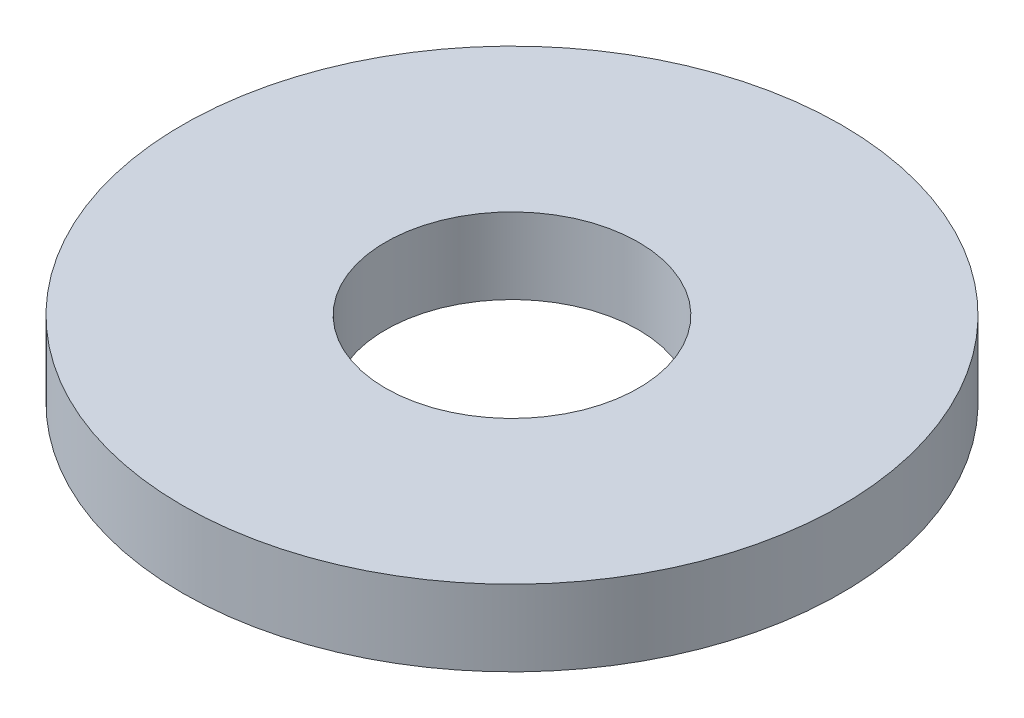
ISO-10303-21;
HEADER;
FILE_DESCRIPTION(('STEP AP214'),'2;1');
FILE_NAME('part.step','',(''),(''),'','','');
FILE_SCHEMA(('AUTOMOTIVE_DESIGN { 1 0 10303 214 1 1 1 1 }'));
ENDSEC;
DATA;
#1=APPLICATION_CONTEXT('core data for automotive mechanical design processes');
#2=APPLICATION_PROTOCOL_DEFINITION('international standard','automotive_design',2000,#1);
#3=PRODUCT_CONTEXT('',#1,'mechanical');
#4=PRODUCT('Part','Part','',(#3));
#5=PRODUCT_RELATED_PRODUCT_CATEGORY('part','',(#4));
#6=PRODUCT_DEFINITION_FORMATION('','',#4);
#7=PRODUCT_DEFINITION_CONTEXT('part definition',#1,'design');
#8=PRODUCT_DEFINITION('design','',#6,#7);
#9=PRODUCT_DEFINITION_SHAPE('','',#8);
#10=(LENGTH_UNIT() NAMED_UNIT(*) SI_UNIT(.MILLI.,.METRE.));
#11=(NAMED_UNIT(*) PLANE_ANGLE_UNIT() SI_UNIT($,.RADIAN.));
#12=(NAMED_UNIT(*) SI_UNIT($,.STERADIAN.) SOLID_ANGLE_UNIT());
#13=UNCERTAINTY_MEASURE_WITH_UNIT(LENGTH_MEASURE(1.E-05),#10,'distance_accuracy_value','');
#14=(GEOMETRIC_REPRESENTATION_CONTEXT(3) GLOBAL_UNCERTAINTY_ASSIGNED_CONTEXT((#13)) GLOBAL_UNIT_ASSIGNED_CONTEXT((#10,
#11,#12)) REPRESENTATION_CONTEXT('',''));
#15=CARTESIAN_POINT('',(0.,0.,0.));
#16=DIRECTION('',(0.,0.,1.));
#17=DIRECTION('',(1.,0.,0.));
#18=AXIS2_PLACEMENT_3D('',#15,#16,#17);
#19=CARTESIAN_POINT('',(0.,1.4478,0.));
#20=DIRECTION('',(0.,1.,0.));
#21=DIRECTION('',(0.,0.,1.));
#22=AXIS2_PLACEMENT_3D('',#19,#20,#21);
#23=PLANE('',#22);
#24=CARTESIAN_POINT('',(0.,1.4478,0.));
#25=DIRECTION('',(0.,1.,0.));
#26=DIRECTION('',(0.,0.,1.));
#27=AXIS2_PLACEMENT_3D('',#24,#25,#26);
#28=CIRCLE('',#27,6.2865);
#29=CARTESIAN_POINT('',(0.,1.4478,6.2865));
#30=VERTEX_POINT('',#29);
#31=EDGE_CURVE('E10',#30,#30,#28,.T.);
#32=ORIENTED_EDGE('',*,*,#31,.T.);
#33=EDGE_LOOP('',(#32));
#34=FACE_BOUND('',#33,.T.);
#35=CARTESIAN_POINT('',(0.,1.4478,0.));
#36=DIRECTION('',(0.,1.,0.));
#37=DIRECTION('',(0.,0.,1.));
#38=AXIS2_PLACEMENT_3D('',#35,#36,#37);
#39=CIRCLE('',#38,2.413);
#40=CARTESIAN_POINT('',(0.,1.4478,2.413));
#41=VERTEX_POINT('',#40);
#42=EDGE_CURVE('E42',#41,#41,#39,.T.);
#43=ORIENTED_EDGE('',*,*,#42,.F.);
#44=EDGE_LOOP('',(#43));
#45=FACE_BOUND('',#44,.T.);
#46=ADVANCED_FACE('F31',(#34,#45),#23,.T.);
#47=CARTESIAN_POINT('',(0.,0.,0.));
#48=DIRECTION('',(0.,1.,0.));
#49=DIRECTION('',(0.,0.,1.));
#50=AXIS2_PLACEMENT_3D('',#47,#48,#49);
#51=PLANE('',#50);
#52=CARTESIAN_POINT('',(0.,0.,0.));
#53=DIRECTION('',(0.,1.,0.));
#54=DIRECTION('',(0.,0.,1.));
#55=AXIS2_PLACEMENT_3D('',#52,#53,#54);
#56=CIRCLE('',#55,6.2865);
#57=CARTESIAN_POINT('',(0.,0.,6.2865));
#58=VERTEX_POINT('',#57);
#59=EDGE_CURVE('E35',#58,#58,#56,.T.);
#60=ORIENTED_EDGE('',*,*,#59,.F.);
#61=EDGE_LOOP('',(#60));
#62=FACE_BOUND('',#61,.T.);
#63=CARTESIAN_POINT('',(0.,0.,0.));
#64=DIRECTION('',(0.,1.,0.));
#65=DIRECTION('',(0.,0.,1.));
#66=AXIS2_PLACEMENT_3D('',#63,#64,#65);
#67=CIRCLE('',#66,2.413);
#68=CARTESIAN_POINT('',(0.,0.,2.413));
#69=VERTEX_POINT('',#68);
#70=EDGE_CURVE('E44',#69,#69,#67,.T.);
#71=ORIENTED_EDGE('',*,*,#70,.T.);
#72=EDGE_LOOP('',(#71));
#73=FACE_BOUND('',#72,.T.);
#74=ADVANCED_FACE('F54',(#62,#73),#51,.F.);
#75=CARTESIAN_POINT('',(0.,1.4478,0.));
#76=DIRECTION('',(0.,-1.,0.));
#77=DIRECTION('',(0.,0.,-1.));
#78=AXIS2_PLACEMENT_3D('',#75,#76,#77);
#79=CYLINDRICAL_SURFACE('',#78,6.2865);
#80=ORIENTED_EDGE('',*,*,#31,.F.);
#81=EDGE_LOOP('',(#80));
#82=FACE_BOUND('',#81,.T.);
#83=ORIENTED_EDGE('',*,*,#59,.T.);
#84=EDGE_LOOP('',(#83));
#85=FACE_BOUND('',#84,.T.);
#86=ADVANCED_FACE('F33',(#82,#85),#79,.T.);
#87=CARTESIAN_POINT('',(0.,1.4478,0.));
#88=DIRECTION('',(0.,-1.,0.));
#89=DIRECTION('',(0.,0.,-1.));
#90=AXIS2_PLACEMENT_3D('',#87,#88,#89);
#91=CYLINDRICAL_SURFACE('',#90,2.413);
#92=ORIENTED_EDGE('',*,*,#42,.T.);
#93=EDGE_LOOP('',(#92));
#94=FACE_BOUND('',#93,.T.);
#95=ORIENTED_EDGE('',*,*,#70,.F.);
#96=EDGE_LOOP('',(#95));
#97=FACE_BOUND('',#96,.T.);
#98=ADVANCED_FACE('F50',(#94,#97),#91,.F.);
#99=CLOSED_SHELL('',(#46,#74,#86,#98));
#100=MANIFOLD_SOLID_BREP('B2',#99);
#101=ADVANCED_BREP_SHAPE_REPRESENTATION('',(#18,#100),#14);
#102=SHAPE_DEFINITION_REPRESENTATION(#9,#101);
ENDSEC;
END-ISO-10303-21;
